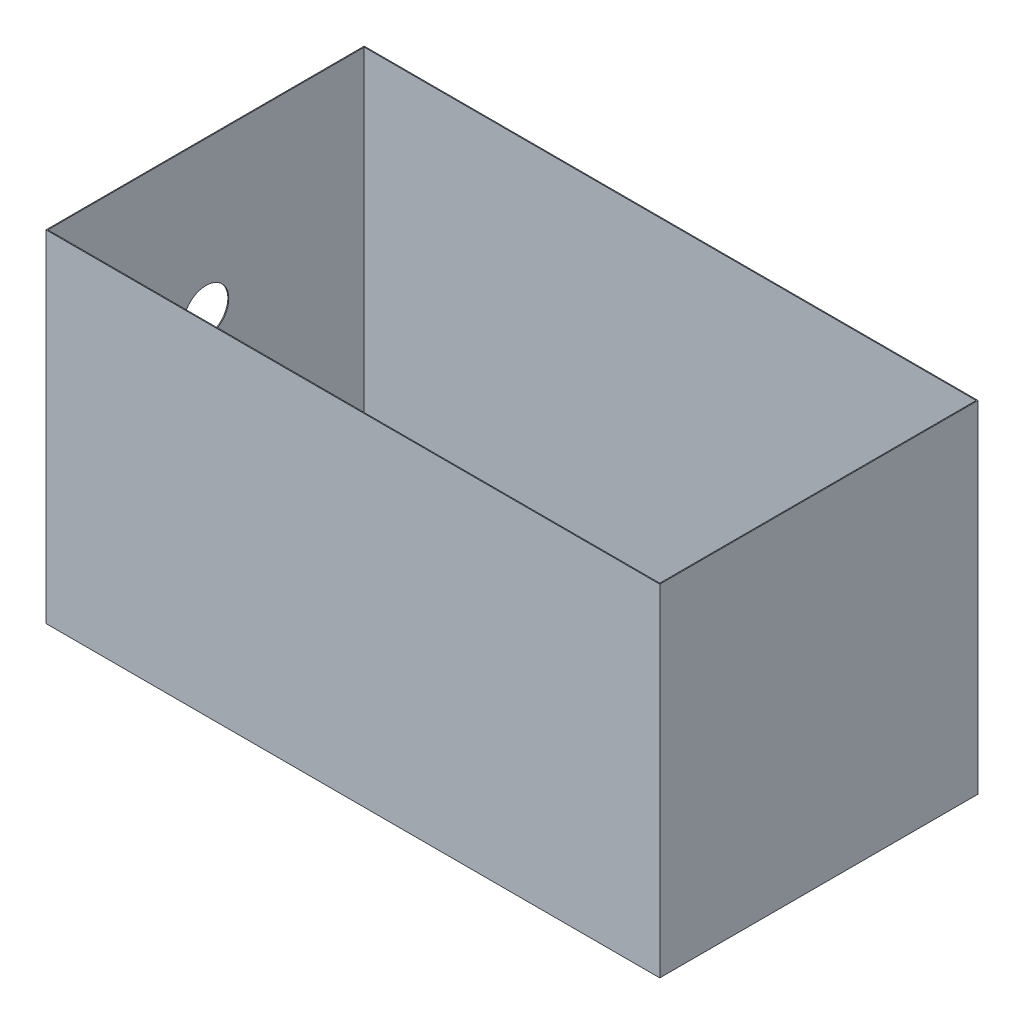
ISO-10303-21;
HEADER;
FILE_DESCRIPTION(('STEP AP214'),'2;1');
FILE_NAME('part.step','',(''),(''),'','','');
FILE_SCHEMA(('AUTOMOTIVE_DESIGN { 1 0 10303 214 1 1 1 1 }'));
ENDSEC;
DATA;
#1=APPLICATION_CONTEXT('core data for automotive mechanical design processes');
#2=APPLICATION_PROTOCOL_DEFINITION('international standard','automotive_design',2000,#1);
#3=PRODUCT_CONTEXT('',#1,'mechanical');
#4=PRODUCT('Part','Part','',(#3));
#5=PRODUCT_RELATED_PRODUCT_CATEGORY('part','',(#4));
#6=PRODUCT_DEFINITION_FORMATION('','',#4);
#7=PRODUCT_DEFINITION_CONTEXT('part definition',#1,'design');
#8=PRODUCT_DEFINITION('design','',#6,#7);
#9=PRODUCT_DEFINITION_SHAPE('','',#8);
#10=(LENGTH_UNIT() NAMED_UNIT(*) SI_UNIT(.MILLI.,.METRE.));
#11=(NAMED_UNIT(*) PLANE_ANGLE_UNIT() SI_UNIT($,.RADIAN.));
#12=(NAMED_UNIT(*) SI_UNIT($,.STERADIAN.) SOLID_ANGLE_UNIT());
#13=UNCERTAINTY_MEASURE_WITH_UNIT(LENGTH_MEASURE(1.E-05),#10,'distance_accuracy_value','');
#14=(GEOMETRIC_REPRESENTATION_CONTEXT(3) GLOBAL_UNCERTAINTY_ASSIGNED_CONTEXT((#13)) GLOBAL_UNIT_ASSIGNED_CONTEXT((#10,
#11,#12)) REPRESENTATION_CONTEXT('',''));
#15=CARTESIAN_POINT('',(0.,0.,0.));
#16=DIRECTION('',(0.,0.,1.));
#17=DIRECTION('',(1.,0.,0.));
#18=AXIS2_PLACEMENT_3D('',#15,#16,#17);
#19=CARTESIAN_POINT('',(0.,750.,0.));
#20=DIRECTION('',(0.,-1.,0.));
#21=DIRECTION('',(0.,0.,-1.));
#22=AXIS2_PLACEMENT_3D('',#19,#20,#21);
#23=PLANE('',#22);
#24=DIRECTION('',(0.,0.,1.));
#25=VECTOR('',#24,1.);
#26=CARTESIAN_POINT('',(0.,750.,0.));
#27=LINE('',#26,#25);
#28=CARTESIAN_POINT('',(0.,750.,-700.));
#29=VERTEX_POINT('',#28);
#30=CARTESIAN_POINT('',(0.,750.,0.));
#31=VERTEX_POINT('',#30);
#32=EDGE_CURVE('E155',#29,#31,#27,.T.);
#33=ORIENTED_EDGE('',*,*,#32,.T.);
#34=DIRECTION('',(1.,0.,0.));
#35=VECTOR('',#34,1.);
#36=CARTESIAN_POINT('',(0.,750.,0.));
#37=LINE('',#36,#35);
#38=CARTESIAN_POINT('',(1350.,750.,0.));
#39=VERTEX_POINT('',#38);
#40=EDGE_CURVE('E96',#31,#39,#37,.T.);
#41=ORIENTED_EDGE('',*,*,#40,.T.);
#42=DIRECTION('',(0.,0.,-1.));
#43=VECTOR('',#42,1.);
#44=CARTESIAN_POINT('',(1350.,750.,0.));
#45=LINE('',#44,#43);
#46=CARTESIAN_POINT('',(1350.,750.,-700.));
#47=VERTEX_POINT('',#46);
#48=EDGE_CURVE('E154',#39,#47,#45,.T.);
#49=ORIENTED_EDGE('',*,*,#48,.T.);
#50=DIRECTION('',(-1.,0.,0.));
#51=VECTOR('',#50,1.);
#52=CARTESIAN_POINT('',(0.,750.,-700.));
#53=LINE('',#52,#51);
#54=EDGE_CURVE('E66',#47,#29,#53,.T.);
#55=ORIENTED_EDGE('',*,*,#54,.T.);
#56=EDGE_LOOP('',(#33,#41,#49,#55));
#57=FACE_BOUND('',#56,.T.);
#58=DIRECTION('',(0.,0.,1.));
#59=VECTOR('',#58,1.);
#60=CARTESIAN_POINT('',(2.,750.,0.));
#61=LINE('',#60,#59);
#62=CARTESIAN_POINT('',(2.,750.,-698.));
#63=VERTEX_POINT('',#62);
#64=CARTESIAN_POINT('',(2.,750.,-2.));
#65=VERTEX_POINT('',#64);
#66=EDGE_CURVE('E143',#63,#65,#61,.T.);
#67=ORIENTED_EDGE('',*,*,#66,.F.);
#68=DIRECTION('',(-1.,0.,0.));
#69=VECTOR('',#68,1.);
#70=CARTESIAN_POINT('',(0.,750.,-698.));
#71=LINE('',#70,#69);
#72=CARTESIAN_POINT('',(1348.,750.,-698.));
#73=VERTEX_POINT('',#72);
#74=EDGE_CURVE('E147',#73,#63,#71,.T.);
#75=ORIENTED_EDGE('',*,*,#74,.F.);
#76=DIRECTION('',(0.,0.,-1.));
#77=VECTOR('',#76,1.);
#78=CARTESIAN_POINT('',(1348.,750.,0.));
#79=LINE('',#78,#77);
#80=CARTESIAN_POINT('',(1348.,750.,-2.));
#81=VERTEX_POINT('',#80);
#82=EDGE_CURVE('E146',#81,#73,#79,.T.);
#83=ORIENTED_EDGE('',*,*,#82,.F.);
#84=DIRECTION('',(1.,0.,0.));
#85=VECTOR('',#84,1.);
#86=CARTESIAN_POINT('',(0.,750.,-2.));
#87=LINE('',#86,#85);
#88=EDGE_CURVE('E131',#65,#81,#87,.T.);
#89=ORIENTED_EDGE('',*,*,#88,.F.);
#90=EDGE_LOOP('',(#67,#75,#83,#89));
#91=FACE_BOUND('',#90,.T.);
#92=ADVANCED_FACE('F43',(#57,#91),#23,.F.);
#93=CARTESIAN_POINT('',(0.,750.,0.));
#94=DIRECTION('',(1.,0.,0.));
#95=DIRECTION('',(0.,0.,-1.));
#96=AXIS2_PLACEMENT_3D('',#93,#94,#95);
#97=PLANE('',#96);
#98=CARTESIAN_POINT('',(0.,420.,-350.));
#99=DIRECTION('',(1.,0.,0.));
#100=DIRECTION('',(0.,0.,-1.));
#101=AXIS2_PLACEMENT_3D('',#98,#99,#100);
#102=CIRCLE('',#101,50.);
#103=CARTESIAN_POINT('',(0.,420.,-400.));
#104=VERTEX_POINT('',#103);
#105=EDGE_CURVE('E224',#104,#104,#102,.T.);
#106=ORIENTED_EDGE('',*,*,#105,.T.);
#107=EDGE_LOOP('',(#106));
#108=FACE_BOUND('',#107,.T.);
#109=DIRECTION('',(0.,0.,1.));
#110=VECTOR('',#109,1.);
#111=CARTESIAN_POINT('',(0.,0.,0.));
#112=LINE('',#111,#110);
#113=CARTESIAN_POINT('',(0.,0.,-700.));
#114=VERTEX_POINT('',#113);
#115=CARTESIAN_POINT('',(0.,0.,0.));
#116=VERTEX_POINT('',#115);
#117=EDGE_CURVE('E157',#114,#116,#112,.T.);
#118=ORIENTED_EDGE('',*,*,#117,.T.);
#119=DIRECTION('',(0.,-1.,0.));
#120=VECTOR('',#119,1.);
#121=CARTESIAN_POINT('',(0.,750.,0.));
#122=LINE('',#121,#120);
#123=EDGE_CURVE('E11',#31,#116,#122,.T.);
#124=ORIENTED_EDGE('',*,*,#123,.F.);
#125=ORIENTED_EDGE('',*,*,#32,.F.);
#126=DIRECTION('',(0.,-1.,0.));
#127=VECTOR('',#126,1.);
#128=CARTESIAN_POINT('',(0.,750.,-700.));
#129=LINE('',#128,#127);
#130=EDGE_CURVE('E158',#29,#114,#129,.T.);
#131=ORIENTED_EDGE('',*,*,#130,.T.);
#132=EDGE_LOOP('',(#118,#124,#125,#131));
#133=FACE_BOUND('',#132,.T.);
#134=ADVANCED_FACE('F44',(#108,#133),#97,.F.);
#135=CARTESIAN_POINT('',(0.,750.,0.));
#136=DIRECTION('',(0.,0.,-1.));
#137=DIRECTION('',(-1.,0.,0.));
#138=AXIS2_PLACEMENT_3D('',#135,#136,#137);
#139=PLANE('',#138);
#140=DIRECTION('',(1.,0.,0.));
#141=VECTOR('',#140,1.);
#142=CARTESIAN_POINT('',(0.,0.,0.));
#143=LINE('',#142,#141);
#144=CARTESIAN_POINT('',(1350.,0.,0.));
#145=VERTEX_POINT('',#144);
#146=EDGE_CURVE('E165',#116,#145,#143,.T.);
#147=ORIENTED_EDGE('',*,*,#146,.T.);
#148=DIRECTION('',(0.,-1.,0.));
#149=VECTOR('',#148,1.);
#150=CARTESIAN_POINT('',(1350.,750.,0.));
#151=LINE('',#150,#149);
#152=EDGE_CURVE('E55',#39,#145,#151,.T.);
#153=ORIENTED_EDGE('',*,*,#152,.F.);
#154=ORIENTED_EDGE('',*,*,#40,.F.);
#155=ORIENTED_EDGE('',*,*,#123,.T.);
#156=EDGE_LOOP('',(#147,#153,#154,#155));
#157=FACE_BOUND('',#156,.T.);
#158=ADVANCED_FACE('F193',(#157),#139,.F.);
#159=CARTESIAN_POINT('',(1350.,750.,0.));
#160=DIRECTION('',(-1.,0.,0.));
#161=DIRECTION('',(0.,0.,1.));
#162=AXIS2_PLACEMENT_3D('',#159,#160,#161);
#163=PLANE('',#162);
#164=DIRECTION('',(0.,0.,-1.));
#165=VECTOR('',#164,1.);
#166=CARTESIAN_POINT('',(1350.,0.,0.));
#167=LINE('',#166,#165);
#168=CARTESIAN_POINT('',(1350.,0.,-700.));
#169=VERTEX_POINT('',#168);
#170=EDGE_CURVE('E163',#145,#169,#167,.T.);
#171=ORIENTED_EDGE('',*,*,#170,.T.);
#172=DIRECTION('',(0.,-1.,0.));
#173=VECTOR('',#172,1.);
#174=CARTESIAN_POINT('',(1350.,750.,-700.));
#175=LINE('',#174,#173);
#176=EDGE_CURVE('E169',#47,#169,#175,.T.);
#177=ORIENTED_EDGE('',*,*,#176,.F.);
#178=ORIENTED_EDGE('',*,*,#48,.F.);
#179=ORIENTED_EDGE('',*,*,#152,.T.);
#180=EDGE_LOOP('',(#171,#177,#178,#179));
#181=FACE_BOUND('',#180,.T.);
#182=ADVANCED_FACE('F174',(#181),#163,.F.);
#183=CARTESIAN_POINT('',(0.,750.,-700.));
#184=DIRECTION('',(0.,0.,1.));
#185=DIRECTION('',(1.,0.,0.));
#186=AXIS2_PLACEMENT_3D('',#183,#184,#185);
#187=PLANE('',#186);
#188=DIRECTION('',(-1.,0.,0.));
#189=VECTOR('',#188,1.);
#190=CARTESIAN_POINT('',(0.,0.,-700.));
#191=LINE('',#190,#189);
#192=EDGE_CURVE('E90',#169,#114,#191,.T.);
#193=ORIENTED_EDGE('',*,*,#192,.T.);
#194=ORIENTED_EDGE('',*,*,#130,.F.);
#195=ORIENTED_EDGE('',*,*,#54,.F.);
#196=ORIENTED_EDGE('',*,*,#176,.T.);
#197=EDGE_LOOP('',(#193,#194,#195,#196));
#198=FACE_BOUND('',#197,.T.);
#199=ADVANCED_FACE('F185',(#198),#187,.F.);
#200=CARTESIAN_POINT('',(0.,0.,0.));
#201=DIRECTION('',(0.,-1.,0.));
#202=DIRECTION('',(0.,0.,-1.));
#203=AXIS2_PLACEMENT_3D('',#200,#201,#202);
#204=PLANE('',#203);
#205=ORIENTED_EDGE('',*,*,#117,.F.);
#206=ORIENTED_EDGE('',*,*,#192,.F.);
#207=ORIENTED_EDGE('',*,*,#170,.F.);
#208=ORIENTED_EDGE('',*,*,#146,.F.);
#209=EDGE_LOOP('',(#205,#206,#207,#208));
#210=FACE_BOUND('',#209,.T.);
#211=ADVANCED_FACE('F176',(#210),#204,.T.);
#212=CARTESIAN_POINT('',(2.,750.,0.));
#213=DIRECTION('',(1.,0.,0.));
#214=DIRECTION('',(0.,0.,-1.));
#215=AXIS2_PLACEMENT_3D('',#212,#213,#214);
#216=PLANE('',#215);
#217=CARTESIAN_POINT('',(2.,420.,-350.));
#218=DIRECTION('',(1.,0.,0.));
#219=DIRECTION('',(0.,0.,-1.));
#220=AXIS2_PLACEMENT_3D('',#217,#218,#219);
#221=CIRCLE('',#220,50.);
#222=CARTESIAN_POINT('',(2.,420.,-400.));
#223=VERTEX_POINT('',#222);
#224=EDGE_CURVE('E50',#223,#223,#221,.F.);
#225=ORIENTED_EDGE('',*,*,#224,.T.);
#226=EDGE_LOOP('',(#225));
#227=FACE_BOUND('',#226,.T.);
#228=DIRECTION('',(0.,0.,1.));
#229=VECTOR('',#228,1.);
#230=CARTESIAN_POINT('',(2.,2.,0.));
#231=LINE('',#230,#229);
#232=CARTESIAN_POINT('',(2.,2.,-698.));
#233=VERTEX_POINT('',#232);
#234=CARTESIAN_POINT('',(2.,2.,-2.));
#235=VERTEX_POINT('',#234);
#236=EDGE_CURVE('E124',#233,#235,#231,.T.);
#237=ORIENTED_EDGE('',*,*,#236,.F.);
#238=DIRECTION('',(0.,-1.,0.));
#239=VECTOR('',#238,1.);
#240=CARTESIAN_POINT('',(2.,750.,-698.));
#241=LINE('',#240,#239);
#242=EDGE_CURVE('E145',#63,#233,#241,.T.);
#243=ORIENTED_EDGE('',*,*,#242,.F.);
#244=ORIENTED_EDGE('',*,*,#66,.T.);
#245=DIRECTION('',(0.,-1.,0.));
#246=VECTOR('',#245,1.);
#247=CARTESIAN_POINT('',(2.,750.,-2.));
#248=LINE('',#247,#246);
#249=EDGE_CURVE('E138',#65,#235,#248,.T.);
#250=ORIENTED_EDGE('',*,*,#249,.T.);
#251=EDGE_LOOP('',(#237,#243,#244,#250));
#252=FACE_BOUND('',#251,.T.);
#253=ADVANCED_FACE('F189',(#227,#252),#216,.T.);
#254=CARTESIAN_POINT('',(0.,750.,-2.));
#255=DIRECTION('',(0.,0.,-1.));
#256=DIRECTION('',(-1.,0.,0.));
#257=AXIS2_PLACEMENT_3D('',#254,#255,#256);
#258=PLANE('',#257);
#259=DIRECTION('',(1.,0.,0.));
#260=VECTOR('',#259,1.);
#261=CARTESIAN_POINT('',(0.,2.,-2.));
#262=LINE('',#261,#260);
#263=CARTESIAN_POINT('',(1348.,2.,-2.));
#264=VERTEX_POINT('',#263);
#265=EDGE_CURVE('E116',#235,#264,#262,.T.);
#266=ORIENTED_EDGE('',*,*,#265,.F.);
#267=ORIENTED_EDGE('',*,*,#249,.F.);
#268=ORIENTED_EDGE('',*,*,#88,.T.);
#269=DIRECTION('',(0.,-1.,0.));
#270=VECTOR('',#269,1.);
#271=CARTESIAN_POINT('',(1348.,750.,-2.));
#272=LINE('',#271,#270);
#273=EDGE_CURVE('E128',#81,#264,#272,.T.);
#274=ORIENTED_EDGE('',*,*,#273,.T.);
#275=EDGE_LOOP('',(#266,#267,#268,#274));
#276=FACE_BOUND('',#275,.T.);
#277=ADVANCED_FACE('F133',(#276),#258,.T.);
#278=CARTESIAN_POINT('',(1348.,750.,0.));
#279=DIRECTION('',(-1.,0.,0.));
#280=DIRECTION('',(0.,0.,1.));
#281=AXIS2_PLACEMENT_3D('',#278,#279,#280);
#282=PLANE('',#281);
#283=DIRECTION('',(0.,0.,-1.));
#284=VECTOR('',#283,1.);
#285=CARTESIAN_POINT('',(1348.,2.,0.));
#286=LINE('',#285,#284);
#287=CARTESIAN_POINT('',(1348.,2.,-698.));
#288=VERTEX_POINT('',#287);
#289=EDGE_CURVE('E125',#264,#288,#286,.T.);
#290=ORIENTED_EDGE('',*,*,#289,.F.);
#291=ORIENTED_EDGE('',*,*,#273,.F.);
#292=ORIENTED_EDGE('',*,*,#82,.T.);
#293=DIRECTION('',(0.,-1.,0.));
#294=VECTOR('',#293,1.);
#295=CARTESIAN_POINT('',(1348.,750.,-698.));
#296=LINE('',#295,#294);
#297=EDGE_CURVE('E56',#73,#288,#296,.T.);
#298=ORIENTED_EDGE('',*,*,#297,.T.);
#299=EDGE_LOOP('',(#290,#291,#292,#298));
#300=FACE_BOUND('',#299,.T.);
#301=ADVANCED_FACE('F136',(#300),#282,.T.);
#302=CARTESIAN_POINT('',(0.,750.,-698.));
#303=DIRECTION('',(0.,0.,1.));
#304=DIRECTION('',(1.,0.,0.));
#305=AXIS2_PLACEMENT_3D('',#302,#303,#304);
#306=PLANE('',#305);
#307=DIRECTION('',(-1.,0.,0.));
#308=VECTOR('',#307,1.);
#309=CARTESIAN_POINT('',(0.,2.,-698.));
#310=LINE('',#309,#308);
#311=EDGE_CURVE('E139',#288,#233,#310,.T.);
#312=ORIENTED_EDGE('',*,*,#311,.F.);
#313=ORIENTED_EDGE('',*,*,#297,.F.);
#314=ORIENTED_EDGE('',*,*,#74,.T.);
#315=ORIENTED_EDGE('',*,*,#242,.T.);
#316=EDGE_LOOP('',(#312,#313,#314,#315));
#317=FACE_BOUND('',#316,.T.);
#318=ADVANCED_FACE('F202',(#317),#306,.T.);
#319=CARTESIAN_POINT('',(0.,2.,0.));
#320=DIRECTION('',(0.,-1.,0.));
#321=DIRECTION('',(0.,0.,-1.));
#322=AXIS2_PLACEMENT_3D('',#319,#320,#321);
#323=PLANE('',#322);
#324=ORIENTED_EDGE('',*,*,#236,.T.);
#325=ORIENTED_EDGE('',*,*,#265,.T.);
#326=ORIENTED_EDGE('',*,*,#289,.T.);
#327=ORIENTED_EDGE('',*,*,#311,.T.);
#328=EDGE_LOOP('',(#324,#325,#326,#327));
#329=FACE_BOUND('',#328,.T.);
#330=ADVANCED_FACE('F117',(#329),#323,.F.);
#331=CARTESIAN_POINT('',(10.,420.,-350.));
#332=DIRECTION('',(-1.,0.,0.));
#333=DIRECTION('',(0.,0.,1.));
#334=AXIS2_PLACEMENT_3D('',#331,#332,#333);
#335=CYLINDRICAL_SURFACE('',#334,50.);
#336=ORIENTED_EDGE('',*,*,#224,.F.);
#337=EDGE_LOOP('',(#336));
#338=FACE_BOUND('',#337,.T.);
#339=ORIENTED_EDGE('',*,*,#105,.F.);
#340=EDGE_LOOP('',(#339));
#341=FACE_BOUND('',#340,.T.);
#342=ADVANCED_FACE('F204',(#338,#341),#335,.F.);
#343=CLOSED_SHELL('',(#92,#134,#158,#182,#199,#211,#253,#277,#301,#318,#330,#342));
#344=MANIFOLD_SOLID_BREP('B2',#343);
#345=ADVANCED_BREP_SHAPE_REPRESENTATION('',(#18,#344),#14);
#346=SHAPE_DEFINITION_REPRESENTATION(#9,#345);
ENDSEC;
END-ISO-10303-21;
